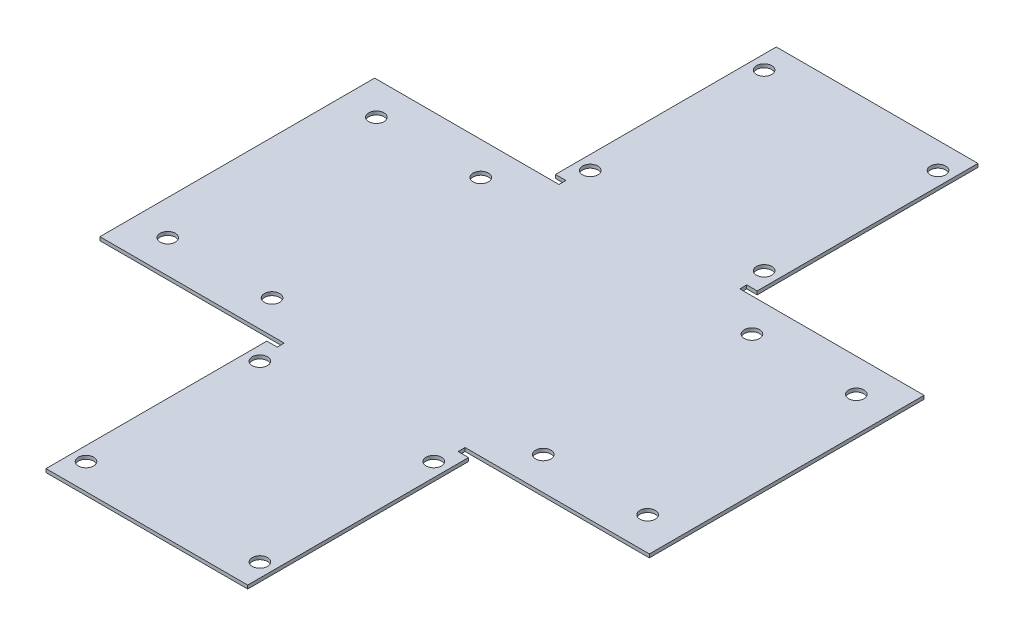
ISO-10303-21;
HEADER;
FILE_DESCRIPTION(('STEP AP214'),'2;1');
FILE_NAME('part.step','',(''),(''),'','','');
FILE_SCHEMA(('AUTOMOTIVE_DESIGN { 1 0 10303 214 1 1 1 1 }'));
ENDSEC;
DATA;
#1=APPLICATION_CONTEXT('core data for automotive mechanical design processes');
#2=APPLICATION_PROTOCOL_DEFINITION('international standard','automotive_design',2000,#1);
#3=PRODUCT_CONTEXT('',#1,'mechanical');
#4=PRODUCT('Part','Part','',(#3));
#5=PRODUCT_RELATED_PRODUCT_CATEGORY('part','',(#4));
#6=PRODUCT_DEFINITION_FORMATION('','',#4);
#7=PRODUCT_DEFINITION_CONTEXT('part definition',#1,'design');
#8=PRODUCT_DEFINITION('design','',#6,#7);
#9=PRODUCT_DEFINITION_SHAPE('','',#8);
#10=(LENGTH_UNIT() NAMED_UNIT(*) SI_UNIT(.MILLI.,.METRE.));
#11=(NAMED_UNIT(*) PLANE_ANGLE_UNIT() SI_UNIT($,.RADIAN.));
#12=(NAMED_UNIT(*) SI_UNIT($,.STERADIAN.) SOLID_ANGLE_UNIT());
#13=UNCERTAINTY_MEASURE_WITH_UNIT(LENGTH_MEASURE(1.E-05),#10,'distance_accuracy_value','');
#14=(GEOMETRIC_REPRESENTATION_CONTEXT(3) GLOBAL_UNCERTAINTY_ASSIGNED_CONTEXT((#13)) GLOBAL_UNIT_ASSIGNED_CONTEXT((#10,
#11,#12)) REPRESENTATION_CONTEXT('',''));
#15=CARTESIAN_POINT('',(0.,0.,0.));
#16=DIRECTION('',(0.,0.,1.));
#17=DIRECTION('',(1.,0.,0.));
#18=AXIS2_PLACEMENT_3D('',#15,#16,#17);
#19=CARTESIAN_POINT('',(0.,1.,0.));
#20=DIRECTION('',(0.,1.,0.));
#21=DIRECTION('',(0.,0.,1.));
#22=AXIS2_PLACEMENT_3D('',#19,#20,#21);
#23=PLANE('',#22);
#24=CARTESIAN_POINT('',(98.,1.,-30.));
#25=DIRECTION('',(0.,1.,0.));
#26=DIRECTION('',(0.,0.,1.));
#27=AXIS2_PLACEMENT_3D('',#24,#25,#26);
#28=CIRCLE('',#27,2.2);
#29=CARTESIAN_POINT('',(98.,1.,-27.8));
#30=VERTEX_POINT('',#29);
#31=EDGE_CURVE('E758',#30,#30,#28,.T.);
#32=ORIENTED_EDGE('',*,*,#31,.F.);
#33=EDGE_LOOP('',(#32));
#34=FACE_BOUND('',#33,.T.);
#35=CARTESIAN_POINT('',(68.,1.,30.));
#36=DIRECTION('',(0.,1.,0.));
#37=DIRECTION('',(0.,0.,1.));
#38=AXIS2_PLACEMENT_3D('',#35,#36,#37);
#39=CIRCLE('',#38,2.2);
#40=CARTESIAN_POINT('',(68.,1.,32.2));
#41=VERTEX_POINT('',#40);
#42=EDGE_CURVE('E770',#41,#41,#39,.T.);
#43=ORIENTED_EDGE('',*,*,#42,.F.);
#44=EDGE_LOOP('',(#43));
#45=FACE_BOUND('',#44,.T.);
#46=CARTESIAN_POINT('',(-40.,1.,30.));
#47=DIRECTION('',(0.,1.,0.));
#48=DIRECTION('',(0.,0.,1.));
#49=AXIS2_PLACEMENT_3D('',#46,#47,#48);
#50=CIRCLE('',#49,2.2);
#51=CARTESIAN_POINT('',(-40.,1.,32.2));
#52=VERTEX_POINT('',#51);
#53=EDGE_CURVE('E782',#52,#52,#50,.T.);
#54=ORIENTED_EDGE('',*,*,#53,.F.);
#55=EDGE_LOOP('',(#54));
#56=FACE_BOUND('',#55,.T.);
#57=CARTESIAN_POINT('',(-40.,1.,-30.));
#58=DIRECTION('',(0.,1.,0.));
#59=DIRECTION('',(0.,0.,1.));
#60=AXIS2_PLACEMENT_3D('',#57,#58,#59);
#61=CIRCLE('',#60,2.2);
#62=CARTESIAN_POINT('',(-40.,1.,-27.8));
#63=VERTEX_POINT('',#62);
#64=EDGE_CURVE('E794',#63,#63,#61,.T.);
#65=ORIENTED_EDGE('',*,*,#64,.F.);
#66=EDGE_LOOP('',(#65));
#67=FACE_BOUND('',#66,.T.);
#68=CARTESIAN_POINT('',(54.,1.,97.5));
#69=DIRECTION('',(0.,1.,0.));
#70=DIRECTION('',(0.,0.,1.));
#71=AXIS2_PLACEMENT_3D('',#68,#69,#70);
#72=CIRCLE('',#71,2.2);
#73=CARTESIAN_POINT('',(54.,1.,99.7));
#74=VERTEX_POINT('',#73);
#75=EDGE_CURVE('E806',#74,#74,#72,.T.);
#76=ORIENTED_EDGE('',*,*,#75,.F.);
#77=EDGE_LOOP('',(#76));
#78=FACE_BOUND('',#77,.T.);
#79=CARTESIAN_POINT('',(4.00000000000001,1.,47.5));
#80=DIRECTION('',(0.,1.,0.));
#81=DIRECTION('',(0.,0.,1.));
#82=AXIS2_PLACEMENT_3D('',#79,#80,#81);
#83=CIRCLE('',#82,2.2);
#84=CARTESIAN_POINT('',(4.00000000000001,1.,49.7));
#85=VERTEX_POINT('',#84);
#86=EDGE_CURVE('E818',#85,#85,#83,.T.);
#87=ORIENTED_EDGE('',*,*,#86,.F.);
#88=EDGE_LOOP('',(#87));
#89=FACE_BOUND('',#88,.T.);
#90=CARTESIAN_POINT('',(54.,1.,-47.5));
#91=DIRECTION('',(0.,1.,0.));
#92=DIRECTION('',(0.,0.,1.));
#93=AXIS2_PLACEMENT_3D('',#90,#91,#92);
#94=CIRCLE('',#93,2.2);
#95=CARTESIAN_POINT('',(54.,1.,-45.3));
#96=VERTEX_POINT('',#95);
#97=EDGE_CURVE('E830',#96,#96,#94,.T.);
#98=ORIENTED_EDGE('',*,*,#97,.F.);
#99=EDGE_LOOP('',(#98));
#100=FACE_BOUND('',#99,.T.);
#101=CARTESIAN_POINT('',(3.99999999999999,1.,-97.5));
#102=DIRECTION('',(0.,1.,0.));
#103=DIRECTION('',(0.,0.,1.));
#104=AXIS2_PLACEMENT_3D('',#101,#102,#103);
#105=CIRCLE('',#104,2.2);
#106=CARTESIAN_POINT('',(3.99999999999999,1.,-95.3000000000001));
#107=VERTEX_POINT('',#106);
#108=EDGE_CURVE('E210',#107,#107,#105,.T.);
#109=ORIENTED_EDGE('',*,*,#108,.F.);
#110=EDGE_LOOP('',(#109));
#111=FACE_BOUND('',#110,.T.);
#112=DIRECTION('',(-1.,0.,0.));
#113=VECTOR('',#112,1.);
#114=CARTESIAN_POINT('',(0.,1.,-39.5));
#115=LINE('',#114,#113);
#116=CARTESIAN_POINT('',(3.00000000000001,1.,-39.5));
#117=VERTEX_POINT('',#116);
#118=CARTESIAN_POINT('',(-50.,1.,-39.5));
#119=VERTEX_POINT('',#118);
#120=EDGE_CURVE('E50',#117,#119,#115,.T.);
#121=ORIENTED_EDGE('',*,*,#120,.T.);
#122=DIRECTION('',(0.,0.,1.));
#123=VECTOR('',#122,1.);
#124=CARTESIAN_POINT('',(-50.,1.,-39.5));
#125=LINE('',#124,#123);
#126=CARTESIAN_POINT('',(-50.,1.,39.5));
#127=VERTEX_POINT('',#126);
#128=EDGE_CURVE('E130',#119,#127,#125,.T.);
#129=ORIENTED_EDGE('',*,*,#128,.T.);
#130=DIRECTION('',(1.,0.,0.));
#131=VECTOR('',#130,1.);
#132=CARTESIAN_POINT('',(-50.,1.,39.5));
#133=LINE('',#132,#131);
#134=CARTESIAN_POINT('',(3.00000000000002,1.,39.5));
#135=VERTEX_POINT('',#134);
#136=EDGE_CURVE('E296',#127,#135,#133,.T.);
#137=ORIENTED_EDGE('',*,*,#136,.T.);
#138=DIRECTION('',(0.,0.,1.));
#139=VECTOR('',#138,1.);
#140=CARTESIAN_POINT('',(3.00000000000002,1.,39.5));
#141=LINE('',#140,#139);
#142=CARTESIAN_POINT('',(3.00000000000002,1.,41.5));
#143=VERTEX_POINT('',#142);
#144=EDGE_CURVE('E316',#135,#143,#141,.T.);
#145=ORIENTED_EDGE('',*,*,#144,.T.);
#146=DIRECTION('',(-1.,0.,0.));
#147=VECTOR('',#146,1.);
#148=CARTESIAN_POINT('',(3.00000000000002,1.,41.5));
#149=LINE('',#148,#147);
#150=CARTESIAN_POINT('',(0.,1.,41.5));
#151=VERTEX_POINT('',#150);
#152=EDGE_CURVE('E313',#143,#151,#149,.T.);
#153=ORIENTED_EDGE('',*,*,#152,.T.);
#154=DIRECTION('',(0.,0.,1.));
#155=VECTOR('',#154,1.);
#156=CARTESIAN_POINT('',(0.,1.,41.5));
#157=LINE('',#156,#155);
#158=CARTESIAN_POINT('',(0.,1.,105.));
#159=VERTEX_POINT('',#158);
#160=EDGE_CURVE('E315',#151,#159,#157,.T.);
#161=ORIENTED_EDGE('',*,*,#160,.T.);
#162=DIRECTION('',(1.,0.,0.));
#163=VECTOR('',#162,1.);
#164=CARTESIAN_POINT('',(0.,1.,105.));
#165=LINE('',#164,#163);
#166=CARTESIAN_POINT('',(58.,1.,105.));
#167=VERTEX_POINT('',#166);
#168=EDGE_CURVE('E318',#159,#167,#165,.T.);
#169=ORIENTED_EDGE('',*,*,#168,.T.);
#170=DIRECTION('',(0.,0.,-1.));
#171=VECTOR('',#170,1.);
#172=CARTESIAN_POINT('',(58.,1.,105.));
#173=LINE('',#172,#171);
#174=CARTESIAN_POINT('',(58.,1.,41.5));
#175=VERTEX_POINT('',#174);
#176=EDGE_CURVE('E324',#167,#175,#173,.T.);
#177=ORIENTED_EDGE('',*,*,#176,.T.);
#178=DIRECTION('',(-1.,0.,0.));
#179=VECTOR('',#178,1.);
#180=CARTESIAN_POINT('',(58.,1.,41.5));
#181=LINE('',#180,#179);
#182=CARTESIAN_POINT('',(55.,1.,41.5));
#183=VERTEX_POINT('',#182);
#184=EDGE_CURVE('E326',#175,#183,#181,.T.);
#185=ORIENTED_EDGE('',*,*,#184,.T.);
#186=DIRECTION('',(0.,0.,-1.));
#187=VECTOR('',#186,1.);
#188=CARTESIAN_POINT('',(55.,1.,41.5));
#189=LINE('',#188,#187);
#190=CARTESIAN_POINT('',(55.,1.,39.5));
#191=VERTEX_POINT('',#190);
#192=EDGE_CURVE('E328',#183,#191,#189,.T.);
#193=ORIENTED_EDGE('',*,*,#192,.T.);
#194=DIRECTION('',(1.,0.,0.));
#195=VECTOR('',#194,1.);
#196=CARTESIAN_POINT('',(55.,1.,39.5));
#197=LINE('',#196,#195);
#198=CARTESIAN_POINT('',(108.,1.,39.5));
#199=VERTEX_POINT('',#198);
#200=EDGE_CURVE('E330',#191,#199,#197,.T.);
#201=ORIENTED_EDGE('',*,*,#200,.T.);
#202=DIRECTION('',(0.,0.,-1.));
#203=VECTOR('',#202,1.);
#204=CARTESIAN_POINT('',(108.,1.,39.5));
#205=LINE('',#204,#203);
#206=CARTESIAN_POINT('',(108.,1.,-39.5));
#207=VERTEX_POINT('',#206);
#208=EDGE_CURVE('E332',#199,#207,#205,.T.);
#209=ORIENTED_EDGE('',*,*,#208,.T.);
#210=DIRECTION('',(-1.,0.,0.));
#211=VECTOR('',#210,1.);
#212=CARTESIAN_POINT('',(108.,1.,-39.5));
#213=LINE('',#212,#211);
#214=CARTESIAN_POINT('',(55.,1.,-39.5));
#215=VERTEX_POINT('',#214);
#216=EDGE_CURVE('E334',#207,#215,#213,.T.);
#217=ORIENTED_EDGE('',*,*,#216,.T.);
#218=DIRECTION('',(0.,0.,-1.));
#219=VECTOR('',#218,1.);
#220=CARTESIAN_POINT('',(55.,1.,-39.5));
#221=LINE('',#220,#219);
#222=CARTESIAN_POINT('',(55.,1.,-41.5));
#223=VERTEX_POINT('',#222);
#224=EDGE_CURVE('E336',#215,#223,#221,.T.);
#225=ORIENTED_EDGE('',*,*,#224,.T.);
#226=DIRECTION('',(1.,0.,0.));
#227=VECTOR('',#226,1.);
#228=CARTESIAN_POINT('',(55.,1.,-41.5));
#229=LINE('',#228,#227);
#230=CARTESIAN_POINT('',(58.,1.,-41.5));
#231=VERTEX_POINT('',#230);
#232=EDGE_CURVE('E338',#223,#231,#229,.T.);
#233=ORIENTED_EDGE('',*,*,#232,.T.);
#234=DIRECTION('',(0.,0.,-1.));
#235=VECTOR('',#234,1.);
#236=CARTESIAN_POINT('',(58.,1.,-41.5));
#237=LINE('',#236,#235);
#238=CARTESIAN_POINT('',(58.,1.,-105.));
#239=VERTEX_POINT('',#238);
#240=EDGE_CURVE('E340',#231,#239,#237,.T.);
#241=ORIENTED_EDGE('',*,*,#240,.T.);
#242=DIRECTION('',(-1.,0.,0.));
#243=VECTOR('',#242,1.);
#244=CARTESIAN_POINT('',(58.,1.,-105.));
#245=LINE('',#244,#243);
#246=CARTESIAN_POINT('',(0.,1.,-105.));
#247=VERTEX_POINT('',#246);
#248=EDGE_CURVE('E186',#239,#247,#245,.T.);
#249=ORIENTED_EDGE('',*,*,#248,.T.);
#250=DIRECTION('',(0.,0.,1.));
#251=VECTOR('',#250,1.);
#252=CARTESIAN_POINT('',(0.,1.,-105.));
#253=LINE('',#252,#251);
#254=CARTESIAN_POINT('',(0.,1.,-41.5));
#255=VERTEX_POINT('',#254);
#256=EDGE_CURVE('E180',#247,#255,#253,.T.);
#257=ORIENTED_EDGE('',*,*,#256,.T.);
#258=DIRECTION('',(1.,0.,0.));
#259=VECTOR('',#258,1.);
#260=CARTESIAN_POINT('',(0.,1.,-41.5));
#261=LINE('',#260,#259);
#262=CARTESIAN_POINT('',(3.00000000000001,1.,-41.5));
#263=VERTEX_POINT('',#262);
#264=EDGE_CURVE('E184',#255,#263,#261,.T.);
#265=ORIENTED_EDGE('',*,*,#264,.T.);
#266=DIRECTION('',(0.,0.,1.));
#267=VECTOR('',#266,1.);
#268=CARTESIAN_POINT('',(3.00000000000001,1.,-41.5));
#269=LINE('',#268,#267);
#270=EDGE_CURVE('E200',#263,#117,#269,.T.);
#271=ORIENTED_EDGE('',*,*,#270,.T.);
#272=EDGE_LOOP('',(#121,#129,#137,#145,#153,#161,#169,#177,#185,#193,#201,#209,#217,#225,#233,
#241,#249,#257,#265,#271));
#273=FACE_BOUND('',#272,.T.);
#274=CARTESIAN_POINT('',(54.,1.,-97.5));
#275=DIRECTION('',(0.,1.,0.));
#276=DIRECTION('',(0.,0.,1.));
#277=AXIS2_PLACEMENT_3D('',#274,#275,#276);
#278=CIRCLE('',#277,2.2);
#279=CARTESIAN_POINT('',(54.,1.,-95.3000000000001));
#280=VERTEX_POINT('',#279);
#281=EDGE_CURVE('E836',#280,#280,#278,.T.);
#282=ORIENTED_EDGE('',*,*,#281,.F.);
#283=EDGE_LOOP('',(#282));
#284=FACE_BOUND('',#283,.T.);
#285=CARTESIAN_POINT('',(4.,1.,-47.5));
#286=DIRECTION('',(0.,1.,0.));
#287=DIRECTION('',(0.,0.,1.));
#288=AXIS2_PLACEMENT_3D('',#285,#286,#287);
#289=CIRCLE('',#288,2.2);
#290=CARTESIAN_POINT('',(4.,1.,-45.3));
#291=VERTEX_POINT('',#290);
#292=EDGE_CURVE('E824',#291,#291,#289,.T.);
#293=ORIENTED_EDGE('',*,*,#292,.F.);
#294=EDGE_LOOP('',(#293));
#295=FACE_BOUND('',#294,.T.);
#296=CARTESIAN_POINT('',(54.,1.,47.5));
#297=DIRECTION('',(0.,1.,0.));
#298=DIRECTION('',(0.,0.,1.));
#299=AXIS2_PLACEMENT_3D('',#296,#297,#298);
#300=CIRCLE('',#299,2.2);
#301=CARTESIAN_POINT('',(54.,1.,49.7));
#302=VERTEX_POINT('',#301);
#303=EDGE_CURVE('E812',#302,#302,#300,.T.);
#304=ORIENTED_EDGE('',*,*,#303,.F.);
#305=EDGE_LOOP('',(#304));
#306=FACE_BOUND('',#305,.T.);
#307=CARTESIAN_POINT('',(4.00000000000001,1.,97.5));
#308=DIRECTION('',(0.,1.,0.));
#309=DIRECTION('',(0.,0.,1.));
#310=AXIS2_PLACEMENT_3D('',#307,#308,#309);
#311=CIRCLE('',#310,2.2);
#312=CARTESIAN_POINT('',(4.00000000000001,1.,99.7));
#313=VERTEX_POINT('',#312);
#314=EDGE_CURVE('E800',#313,#313,#311,.T.);
#315=ORIENTED_EDGE('',*,*,#314,.F.);
#316=EDGE_LOOP('',(#315));
#317=FACE_BOUND('',#316,.T.);
#318=CARTESIAN_POINT('',(-9.99999999999999,1.,-30.));
#319=DIRECTION('',(0.,1.,0.));
#320=DIRECTION('',(0.,0.,1.));
#321=AXIS2_PLACEMENT_3D('',#318,#319,#320);
#322=CIRCLE('',#321,2.2);
#323=CARTESIAN_POINT('',(-9.99999999999999,1.,-27.8));
#324=VERTEX_POINT('',#323);
#325=EDGE_CURVE('E788',#324,#324,#322,.T.);
#326=ORIENTED_EDGE('',*,*,#325,.F.);
#327=EDGE_LOOP('',(#326));
#328=FACE_BOUND('',#327,.T.);
#329=CARTESIAN_POINT('',(-9.99999999999999,1.,30.));
#330=DIRECTION('',(0.,1.,0.));
#331=DIRECTION('',(0.,0.,1.));
#332=AXIS2_PLACEMENT_3D('',#329,#330,#331);
#333=CIRCLE('',#332,2.2);
#334=CARTESIAN_POINT('',(-9.99999999999999,1.,32.2));
#335=VERTEX_POINT('',#334);
#336=EDGE_CURVE('E776',#335,#335,#333,.T.);
#337=ORIENTED_EDGE('',*,*,#336,.F.);
#338=EDGE_LOOP('',(#337));
#339=FACE_BOUND('',#338,.T.);
#340=CARTESIAN_POINT('',(98.,1.,30.));
#341=DIRECTION('',(0.,1.,0.));
#342=DIRECTION('',(0.,0.,1.));
#343=AXIS2_PLACEMENT_3D('',#340,#341,#342);
#344=CIRCLE('',#343,2.2);
#345=CARTESIAN_POINT('',(98.,1.,32.2));
#346=VERTEX_POINT('',#345);
#347=EDGE_CURVE('E764',#346,#346,#344,.T.);
#348=ORIENTED_EDGE('',*,*,#347,.F.);
#349=EDGE_LOOP('',(#348));
#350=FACE_BOUND('',#349,.T.);
#351=CARTESIAN_POINT('',(68.,1.,-30.));
#352=DIRECTION('',(0.,1.,0.));
#353=DIRECTION('',(0.,0.,1.));
#354=AXIS2_PLACEMENT_3D('',#351,#352,#353);
#355=CIRCLE('',#354,2.2);
#356=CARTESIAN_POINT('',(68.,1.,-27.8));
#357=VERTEX_POINT('',#356);
#358=EDGE_CURVE('E749',#357,#357,#355,.T.);
#359=ORIENTED_EDGE('',*,*,#358,.F.);
#360=EDGE_LOOP('',(#359));
#361=FACE_BOUND('',#360,.T.);
#362=ADVANCED_FACE('F33',(#34,#45,#56,#67,#78,#89,#100,#111,#273,#284,#295,#306,#317,#328,#339,
#350,#361),#23,.T.);
#363=CARTESIAN_POINT('',(0.,0.,0.));
#364=DIRECTION('',(0.,1.,0.));
#365=DIRECTION('',(0.,0.,1.));
#366=AXIS2_PLACEMENT_3D('',#363,#364,#365);
#367=PLANE('',#366);
#368=DIRECTION('',(0.,0.,1.));
#369=VECTOR('',#368,1.);
#370=CARTESIAN_POINT('',(-50.,0.,-39.5));
#371=LINE('',#370,#369);
#372=CARTESIAN_POINT('',(-50.,0.,-39.5));
#373=VERTEX_POINT('',#372);
#374=CARTESIAN_POINT('',(-50.,0.,39.5));
#375=VERTEX_POINT('',#374);
#376=EDGE_CURVE('E206',#373,#375,#371,.T.);
#377=ORIENTED_EDGE('',*,*,#376,.F.);
#378=DIRECTION('',(-1.,0.,0.));
#379=VECTOR('',#378,1.);
#380=CARTESIAN_POINT('',(3.00000000000001,0.,-39.5));
#381=LINE('',#380,#379);
#382=CARTESIAN_POINT('',(3.00000000000001,0.,-39.5));
#383=VERTEX_POINT('',#382);
#384=EDGE_CURVE('E245',#383,#373,#381,.T.);
#385=ORIENTED_EDGE('',*,*,#384,.F.);
#386=DIRECTION('',(0.,0.,1.));
#387=VECTOR('',#386,1.);
#388=CARTESIAN_POINT('',(3.00000000000001,0.,-41.5));
#389=LINE('',#388,#387);
#390=CARTESIAN_POINT('',(3.00000000000001,0.,-41.5));
#391=VERTEX_POINT('',#390);
#392=EDGE_CURVE('E123',#391,#383,#389,.T.);
#393=ORIENTED_EDGE('',*,*,#392,.F.);
#394=DIRECTION('',(1.,0.,0.));
#395=VECTOR('',#394,1.);
#396=CARTESIAN_POINT('',(0.,0.,-41.5));
#397=LINE('',#396,#395);
#398=CARTESIAN_POINT('',(0.,0.,-41.5));
#399=VERTEX_POINT('',#398);
#400=EDGE_CURVE('E116',#399,#391,#397,.T.);
#401=ORIENTED_EDGE('',*,*,#400,.F.);
#402=DIRECTION('',(0.,0.,1.));
#403=VECTOR('',#402,1.);
#404=CARTESIAN_POINT('',(0.,0.,-105.));
#405=LINE('',#404,#403);
#406=CARTESIAN_POINT('',(0.,0.,-105.));
#407=VERTEX_POINT('',#406);
#408=EDGE_CURVE('E194',#407,#399,#405,.T.);
#409=ORIENTED_EDGE('',*,*,#408,.F.);
#410=DIRECTION('',(-1.,0.,0.));
#411=VECTOR('',#410,1.);
#412=CARTESIAN_POINT('',(58.,0.,-105.));
#413=LINE('',#412,#411);
#414=CARTESIAN_POINT('',(58.,0.,-105.));
#415=VERTEX_POINT('',#414);
#416=EDGE_CURVE('E240',#415,#407,#413,.T.);
#417=ORIENTED_EDGE('',*,*,#416,.F.);
#418=DIRECTION('',(0.,0.,-1.));
#419=VECTOR('',#418,1.);
#420=CARTESIAN_POINT('',(58.,0.,-41.5));
#421=LINE('',#420,#419);
#422=CARTESIAN_POINT('',(58.,0.,-41.5));
#423=VERTEX_POINT('',#422);
#424=EDGE_CURVE('E238',#423,#415,#421,.T.);
#425=ORIENTED_EDGE('',*,*,#424,.F.);
#426=DIRECTION('',(1.,0.,0.));
#427=VECTOR('',#426,1.);
#428=CARTESIAN_POINT('',(55.,0.,-41.5));
#429=LINE('',#428,#427);
#430=CARTESIAN_POINT('',(55.,0.,-41.5));
#431=VERTEX_POINT('',#430);
#432=EDGE_CURVE('E236',#431,#423,#429,.T.);
#433=ORIENTED_EDGE('',*,*,#432,.F.);
#434=DIRECTION('',(0.,0.,-1.));
#435=VECTOR('',#434,1.);
#436=CARTESIAN_POINT('',(55.,0.,-39.5));
#437=LINE('',#436,#435);
#438=CARTESIAN_POINT('',(55.,0.,-39.5));
#439=VERTEX_POINT('',#438);
#440=EDGE_CURVE('E234',#439,#431,#437,.T.);
#441=ORIENTED_EDGE('',*,*,#440,.F.);
#442=DIRECTION('',(-1.,0.,0.));
#443=VECTOR('',#442,1.);
#444=CARTESIAN_POINT('',(58.,0.,-39.5));
#445=LINE('',#444,#443);
#446=CARTESIAN_POINT('',(108.,0.,-39.5));
#447=VERTEX_POINT('',#446);
#448=EDGE_CURVE('E232',#447,#439,#445,.T.);
#449=ORIENTED_EDGE('',*,*,#448,.F.);
#450=DIRECTION('',(0.,0.,-1.));
#451=VECTOR('',#450,1.);
#452=CARTESIAN_POINT('',(108.,0.,39.5));
#453=LINE('',#452,#451);
#454=CARTESIAN_POINT('',(108.,0.,39.5));
#455=VERTEX_POINT('',#454);
#456=EDGE_CURVE('E229',#455,#447,#453,.T.);
#457=ORIENTED_EDGE('',*,*,#456,.F.);
#458=DIRECTION('',(1.,0.,0.));
#459=VECTOR('',#458,1.);
#460=CARTESIAN_POINT('',(58.,0.,39.5));
#461=LINE('',#460,#459);
#462=CARTESIAN_POINT('',(55.,0.,39.5));
#463=VERTEX_POINT('',#462);
#464=EDGE_CURVE('E227',#463,#455,#461,.T.);
#465=ORIENTED_EDGE('',*,*,#464,.F.);
#466=DIRECTION('',(0.,0.,-1.));
#467=VECTOR('',#466,1.);
#468=CARTESIAN_POINT('',(55.,0.,41.5));
#469=LINE('',#468,#467);
#470=CARTESIAN_POINT('',(55.,0.,41.5));
#471=VERTEX_POINT('',#470);
#472=EDGE_CURVE('E224',#471,#463,#469,.T.);
#473=ORIENTED_EDGE('',*,*,#472,.F.);
#474=DIRECTION('',(-1.,0.,0.));
#475=VECTOR('',#474,1.);
#476=CARTESIAN_POINT('',(58.,0.,41.5));
#477=LINE('',#476,#475);
#478=CARTESIAN_POINT('',(58.,0.,41.5));
#479=VERTEX_POINT('',#478);
#480=EDGE_CURVE('E222',#479,#471,#477,.T.);
#481=ORIENTED_EDGE('',*,*,#480,.F.);
#482=DIRECTION('',(0.,0.,-1.));
#483=VECTOR('',#482,1.);
#484=CARTESIAN_POINT('',(58.,0.,105.));
#485=LINE('',#484,#483);
#486=CARTESIAN_POINT('',(58.,0.,105.));
#487=VERTEX_POINT('',#486);
#488=EDGE_CURVE('E220',#487,#479,#485,.T.);
#489=ORIENTED_EDGE('',*,*,#488,.F.);
#490=DIRECTION('',(1.,0.,0.));
#491=VECTOR('',#490,1.);
#492=CARTESIAN_POINT('',(0.,0.,105.));
#493=LINE('',#492,#491);
#494=CARTESIAN_POINT('',(0.,0.,105.));
#495=VERTEX_POINT('',#494);
#496=EDGE_CURVE('E218',#495,#487,#493,.T.);
#497=ORIENTED_EDGE('',*,*,#496,.F.);
#498=DIRECTION('',(0.,0.,1.));
#499=VECTOR('',#498,1.);
#500=CARTESIAN_POINT('',(0.,0.,41.5));
#501=LINE('',#500,#499);
#502=CARTESIAN_POINT('',(0.,0.,41.5));
#503=VERTEX_POINT('',#502);
#504=EDGE_CURVE('E216',#503,#495,#501,.T.);
#505=ORIENTED_EDGE('',*,*,#504,.F.);
#506=DIRECTION('',(-1.,0.,0.));
#507=VECTOR('',#506,1.);
#508=CARTESIAN_POINT('',(3.00000000000002,0.,41.5));
#509=LINE('',#508,#507);
#510=CARTESIAN_POINT('',(3.00000000000002,0.,41.5));
#511=VERTEX_POINT('',#510);
#512=EDGE_CURVE('E214',#511,#503,#509,.T.);
#513=ORIENTED_EDGE('',*,*,#512,.F.);
#514=DIRECTION('',(0.,0.,1.));
#515=VECTOR('',#514,1.);
#516=CARTESIAN_POINT('',(3.00000000000002,0.,39.5));
#517=LINE('',#516,#515);
#518=CARTESIAN_POINT('',(3.00000000000002,0.,39.5));
#519=VERTEX_POINT('',#518);
#520=EDGE_CURVE('E212',#519,#511,#517,.T.);
#521=ORIENTED_EDGE('',*,*,#520,.F.);
#522=DIRECTION('',(1.,0.,0.));
#523=VECTOR('',#522,1.);
#524=CARTESIAN_POINT('',(0.,0.,39.5));
#525=LINE('',#524,#523);
#526=EDGE_CURVE('E209',#375,#519,#525,.T.);
#527=ORIENTED_EDGE('',*,*,#526,.F.);
#528=EDGE_LOOP('',(#377,#385,#393,#401,#409,#417,#425,#433,#441,#449,#457,#465,#473,#481,#489,
#497,#505,#513,#521,#527));
#529=FACE_BOUND('',#528,.T.);
#530=CARTESIAN_POINT('',(3.99999999999999,0.,-97.5));
#531=DIRECTION('',(0.,1.,0.));
#532=DIRECTION('',(0.,0.,1.));
#533=AXIS2_PLACEMENT_3D('',#530,#531,#532);
#534=CIRCLE('',#533,2.2);
#535=CARTESIAN_POINT('',(3.99999999999999,0.,-95.3000000000001));
#536=VERTEX_POINT('',#535);
#537=EDGE_CURVE('E839',#536,#536,#534,.T.);
#538=ORIENTED_EDGE('',*,*,#537,.T.);
#539=EDGE_LOOP('',(#538));
#540=FACE_BOUND('',#539,.T.);
#541=CARTESIAN_POINT('',(54.,0.,-97.5));
#542=DIRECTION('',(0.,1.,0.));
#543=DIRECTION('',(0.,0.,1.));
#544=AXIS2_PLACEMENT_3D('',#541,#542,#543);
#545=CIRCLE('',#544,2.2);
#546=CARTESIAN_POINT('',(54.,0.,-95.3000000000001));
#547=VERTEX_POINT('',#546);
#548=EDGE_CURVE('E833',#547,#547,#545,.T.);
#549=ORIENTED_EDGE('',*,*,#548,.T.);
#550=EDGE_LOOP('',(#549));
#551=FACE_BOUND('',#550,.T.);
#552=CARTESIAN_POINT('',(54.,0.,-47.5));
#553=DIRECTION('',(0.,1.,0.));
#554=DIRECTION('',(0.,0.,1.));
#555=AXIS2_PLACEMENT_3D('',#552,#553,#554);
#556=CIRCLE('',#555,2.2);
#557=CARTESIAN_POINT('',(54.,0.,-45.3));
#558=VERTEX_POINT('',#557);
#559=EDGE_CURVE('E827',#558,#558,#556,.T.);
#560=ORIENTED_EDGE('',*,*,#559,.T.);
#561=EDGE_LOOP('',(#560));
#562=FACE_BOUND('',#561,.T.);
#563=CARTESIAN_POINT('',(4.,0.,-47.5));
#564=DIRECTION('',(0.,1.,0.));
#565=DIRECTION('',(0.,0.,1.));
#566=AXIS2_PLACEMENT_3D('',#563,#564,#565);
#567=CIRCLE('',#566,2.2);
#568=CARTESIAN_POINT('',(4.,0.,-45.3));
#569=VERTEX_POINT('',#568);
#570=EDGE_CURVE('E821',#569,#569,#567,.T.);
#571=ORIENTED_EDGE('',*,*,#570,.T.);
#572=EDGE_LOOP('',(#571));
#573=FACE_BOUND('',#572,.T.);
#574=CARTESIAN_POINT('',(4.00000000000001,0.,47.5));
#575=DIRECTION('',(0.,1.,0.));
#576=DIRECTION('',(0.,0.,1.));
#577=AXIS2_PLACEMENT_3D('',#574,#575,#576);
#578=CIRCLE('',#577,2.2);
#579=CARTESIAN_POINT('',(4.00000000000001,0.,49.7));
#580=VERTEX_POINT('',#579);
#581=EDGE_CURVE('E815',#580,#580,#578,.T.);
#582=ORIENTED_EDGE('',*,*,#581,.T.);
#583=EDGE_LOOP('',(#582));
#584=FACE_BOUND('',#583,.T.);
#585=CARTESIAN_POINT('',(54.,0.,47.5));
#586=DIRECTION('',(0.,1.,0.));
#587=DIRECTION('',(0.,0.,1.));
#588=AXIS2_PLACEMENT_3D('',#585,#586,#587);
#589=CIRCLE('',#588,2.2);
#590=CARTESIAN_POINT('',(54.,0.,49.7));
#591=VERTEX_POINT('',#590);
#592=EDGE_CURVE('E809',#591,#591,#589,.T.);
#593=ORIENTED_EDGE('',*,*,#592,.T.);
#594=EDGE_LOOP('',(#593));
#595=FACE_BOUND('',#594,.T.);
#596=CARTESIAN_POINT('',(54.,0.,97.5));
#597=DIRECTION('',(0.,1.,0.));
#598=DIRECTION('',(0.,0.,1.));
#599=AXIS2_PLACEMENT_3D('',#596,#597,#598);
#600=CIRCLE('',#599,2.2);
#601=CARTESIAN_POINT('',(54.,0.,99.7));
#602=VERTEX_POINT('',#601);
#603=EDGE_CURVE('E803',#602,#602,#600,.T.);
#604=ORIENTED_EDGE('',*,*,#603,.T.);
#605=EDGE_LOOP('',(#604));
#606=FACE_BOUND('',#605,.T.);
#607=CARTESIAN_POINT('',(4.00000000000001,0.,97.5));
#608=DIRECTION('',(0.,1.,0.));
#609=DIRECTION('',(0.,0.,1.));
#610=AXIS2_PLACEMENT_3D('',#607,#608,#609);
#611=CIRCLE('',#610,2.2);
#612=CARTESIAN_POINT('',(4.00000000000001,0.,99.7));
#613=VERTEX_POINT('',#612);
#614=EDGE_CURVE('E797',#613,#613,#611,.T.);
#615=ORIENTED_EDGE('',*,*,#614,.T.);
#616=EDGE_LOOP('',(#615));
#617=FACE_BOUND('',#616,.T.);
#618=CARTESIAN_POINT('',(-40.,0.,-30.));
#619=DIRECTION('',(0.,1.,0.));
#620=DIRECTION('',(0.,0.,1.));
#621=AXIS2_PLACEMENT_3D('',#618,#619,#620);
#622=CIRCLE('',#621,2.2);
#623=CARTESIAN_POINT('',(-40.,0.,-27.8));
#624=VERTEX_POINT('',#623);
#625=EDGE_CURVE('E791',#624,#624,#622,.T.);
#626=ORIENTED_EDGE('',*,*,#625,.T.);
#627=EDGE_LOOP('',(#626));
#628=FACE_BOUND('',#627,.T.);
#629=CARTESIAN_POINT('',(-9.99999999999999,0.,-30.));
#630=DIRECTION('',(0.,1.,0.));
#631=DIRECTION('',(0.,0.,1.));
#632=AXIS2_PLACEMENT_3D('',#629,#630,#631);
#633=CIRCLE('',#632,2.2);
#634=CARTESIAN_POINT('',(-9.99999999999999,0.,-27.8));
#635=VERTEX_POINT('',#634);
#636=EDGE_CURVE('E785',#635,#635,#633,.T.);
#637=ORIENTED_EDGE('',*,*,#636,.T.);
#638=EDGE_LOOP('',(#637));
#639=FACE_BOUND('',#638,.T.);
#640=CARTESIAN_POINT('',(-40.,0.,30.));
#641=DIRECTION('',(0.,1.,0.));
#642=DIRECTION('',(0.,0.,1.));
#643=AXIS2_PLACEMENT_3D('',#640,#641,#642);
#644=CIRCLE('',#643,2.2);
#645=CARTESIAN_POINT('',(-40.,0.,32.2));
#646=VERTEX_POINT('',#645);
#647=EDGE_CURVE('E779',#646,#646,#644,.T.);
#648=ORIENTED_EDGE('',*,*,#647,.T.);
#649=EDGE_LOOP('',(#648));
#650=FACE_BOUND('',#649,.T.);
#651=CARTESIAN_POINT('',(-9.99999999999999,0.,30.));
#652=DIRECTION('',(0.,1.,0.));
#653=DIRECTION('',(0.,0.,1.));
#654=AXIS2_PLACEMENT_3D('',#651,#652,#653);
#655=CIRCLE('',#654,2.2);
#656=CARTESIAN_POINT('',(-9.99999999999999,0.,32.2));
#657=VERTEX_POINT('',#656);
#658=EDGE_CURVE('E773',#657,#657,#655,.T.);
#659=ORIENTED_EDGE('',*,*,#658,.T.);
#660=EDGE_LOOP('',(#659));
#661=FACE_BOUND('',#660,.T.);
#662=CARTESIAN_POINT('',(68.,0.,30.));
#663=DIRECTION('',(0.,1.,0.));
#664=DIRECTION('',(0.,0.,1.));
#665=AXIS2_PLACEMENT_3D('',#662,#663,#664);
#666=CIRCLE('',#665,2.2);
#667=CARTESIAN_POINT('',(68.,0.,32.2));
#668=VERTEX_POINT('',#667);
#669=EDGE_CURVE('E767',#668,#668,#666,.T.);
#670=ORIENTED_EDGE('',*,*,#669,.T.);
#671=EDGE_LOOP('',(#670));
#672=FACE_BOUND('',#671,.T.);
#673=CARTESIAN_POINT('',(98.,0.,30.));
#674=DIRECTION('',(0.,1.,0.));
#675=DIRECTION('',(0.,0.,1.));
#676=AXIS2_PLACEMENT_3D('',#673,#674,#675);
#677=CIRCLE('',#676,2.2);
#678=CARTESIAN_POINT('',(98.,0.,32.2));
#679=VERTEX_POINT('',#678);
#680=EDGE_CURVE('E761',#679,#679,#677,.T.);
#681=ORIENTED_EDGE('',*,*,#680,.T.);
#682=EDGE_LOOP('',(#681));
#683=FACE_BOUND('',#682,.T.);
#684=CARTESIAN_POINT('',(98.,0.,-30.));
#685=DIRECTION('',(0.,1.,0.));
#686=DIRECTION('',(0.,0.,1.));
#687=AXIS2_PLACEMENT_3D('',#684,#685,#686);
#688=CIRCLE('',#687,2.2);
#689=CARTESIAN_POINT('',(98.,0.,-27.8));
#690=VERTEX_POINT('',#689);
#691=EDGE_CURVE('E755',#690,#690,#688,.T.);
#692=ORIENTED_EDGE('',*,*,#691,.T.);
#693=EDGE_LOOP('',(#692));
#694=FACE_BOUND('',#693,.T.);
#695=CARTESIAN_POINT('',(68.,0.,-30.));
#696=DIRECTION('',(0.,1.,0.));
#697=DIRECTION('',(0.,0.,1.));
#698=AXIS2_PLACEMENT_3D('',#695,#696,#697);
#699=CIRCLE('',#698,2.2);
#700=CARTESIAN_POINT('',(68.,0.,-27.8));
#701=VERTEX_POINT('',#700);
#702=EDGE_CURVE('E752',#701,#701,#699,.T.);
#703=ORIENTED_EDGE('',*,*,#702,.T.);
#704=EDGE_LOOP('',(#703));
#705=FACE_BOUND('',#704,.T.);
#706=ADVANCED_FACE('F300',(#529,#540,#551,#562,#573,#584,#595,#606,#617,#628,#639,#650,#661,
#672,#683,#694,#705),#367,.F.);
#707=CARTESIAN_POINT('',(-50.,1.,-39.5));
#708=DIRECTION('',(1.,0.,0.));
#709=DIRECTION('',(0.,0.,-1.));
#710=AXIS2_PLACEMENT_3D('',#707,#708,#709);
#711=PLANE('',#710);
#712=ORIENTED_EDGE('',*,*,#376,.T.);
#713=DIRECTION('',(0.,-1.,0.));
#714=VECTOR('',#713,1.);
#715=CARTESIAN_POINT('',(-50.,1.,39.5));
#716=LINE('',#715,#714);
#717=EDGE_CURVE('E42',#127,#375,#716,.T.);
#718=ORIENTED_EDGE('',*,*,#717,.F.);
#719=ORIENTED_EDGE('',*,*,#128,.F.);
#720=DIRECTION('',(0.,-1.,0.));
#721=VECTOR('',#720,1.);
#722=CARTESIAN_POINT('',(-50.,1.,-39.5));
#723=LINE('',#722,#721);
#724=EDGE_CURVE('E11',#119,#373,#723,.T.);
#725=ORIENTED_EDGE('',*,*,#724,.T.);
#726=EDGE_LOOP('',(#712,#718,#719,#725));
#727=FACE_BOUND('',#726,.T.);
#728=ADVANCED_FACE('F35',(#727),#711,.F.);
#729=CARTESIAN_POINT('',(0.,1.,39.5));
#730=DIRECTION('',(0.,0.,-1.));
#731=DIRECTION('',(-1.,0.,0.));
#732=AXIS2_PLACEMENT_3D('',#729,#730,#731);
#733=PLANE('',#732);
#734=ORIENTED_EDGE('',*,*,#526,.T.);
#735=DIRECTION('',(0.,-1.,0.));
#736=VECTOR('',#735,1.);
#737=CARTESIAN_POINT('',(3.00000000000002,1.,39.5));
#738=LINE('',#737,#736);
#739=EDGE_CURVE('E289',#135,#519,#738,.T.);
#740=ORIENTED_EDGE('',*,*,#739,.F.);
#741=ORIENTED_EDGE('',*,*,#136,.F.);
#742=ORIENTED_EDGE('',*,*,#717,.T.);
#743=EDGE_LOOP('',(#734,#740,#741,#742));
#744=FACE_BOUND('',#743,.T.);
#745=ADVANCED_FACE('F294',(#744),#733,.F.);
#746=CARTESIAN_POINT('',(3.00000000000002,1.,39.5));
#747=DIRECTION('',(1.,0.,0.));
#748=DIRECTION('',(0.,0.,-1.));
#749=AXIS2_PLACEMENT_3D('',#746,#747,#748);
#750=PLANE('',#749);
#751=ORIENTED_EDGE('',*,*,#520,.T.);
#752=DIRECTION('',(0.,-1.,0.));
#753=VECTOR('',#752,1.);
#754=CARTESIAN_POINT('',(3.00000000000002,1.,41.5));
#755=LINE('',#754,#753);
#756=EDGE_CURVE('E286',#143,#511,#755,.T.);
#757=ORIENTED_EDGE('',*,*,#756,.F.);
#758=ORIENTED_EDGE('',*,*,#144,.F.);
#759=ORIENTED_EDGE('',*,*,#739,.T.);
#760=EDGE_LOOP('',(#751,#757,#758,#759));
#761=FACE_BOUND('',#760,.T.);
#762=ADVANCED_FACE('F307',(#761),#750,.F.);
#763=CARTESIAN_POINT('',(3.00000000000002,1.,41.5));
#764=DIRECTION('',(0.,0.,1.));
#765=DIRECTION('',(1.,0.,0.));
#766=AXIS2_PLACEMENT_3D('',#763,#764,#765);
#767=PLANE('',#766);
#768=ORIENTED_EDGE('',*,*,#512,.T.);
#769=DIRECTION('',(0.,-1.,0.));
#770=VECTOR('',#769,1.);
#771=CARTESIAN_POINT('',(0.,1.,41.5));
#772=LINE('',#771,#770);
#773=EDGE_CURVE('E283',#151,#503,#772,.T.);
#774=ORIENTED_EDGE('',*,*,#773,.F.);
#775=ORIENTED_EDGE('',*,*,#152,.F.);
#776=ORIENTED_EDGE('',*,*,#756,.T.);
#777=EDGE_LOOP('',(#768,#774,#775,#776));
#778=FACE_BOUND('',#777,.T.);
#779=ADVANCED_FACE('F311',(#778),#767,.F.);
#780=CARTESIAN_POINT('',(0.,1.,41.5));
#781=DIRECTION('',(1.,0.,0.));
#782=DIRECTION('',(0.,0.,-1.));
#783=AXIS2_PLACEMENT_3D('',#780,#781,#782);
#784=PLANE('',#783);
#785=ORIENTED_EDGE('',*,*,#504,.T.);
#786=DIRECTION('',(0.,-1.,0.));
#787=VECTOR('',#786,1.);
#788=CARTESIAN_POINT('',(0.,1.,105.));
#789=LINE('',#788,#787);
#790=EDGE_CURVE('E280',#159,#495,#789,.T.);
#791=ORIENTED_EDGE('',*,*,#790,.F.);
#792=ORIENTED_EDGE('',*,*,#160,.F.);
#793=ORIENTED_EDGE('',*,*,#773,.T.);
#794=EDGE_LOOP('',(#785,#791,#792,#793));
#795=FACE_BOUND('',#794,.T.);
#796=ADVANCED_FACE('F394',(#795),#784,.F.);
#797=CARTESIAN_POINT('',(0.,1.,105.));
#798=DIRECTION('',(0.,0.,-1.));
#799=DIRECTION('',(-1.,0.,0.));
#800=AXIS2_PLACEMENT_3D('',#797,#798,#799);
#801=PLANE('',#800);
#802=ORIENTED_EDGE('',*,*,#496,.T.);
#803=DIRECTION('',(0.,-1.,0.));
#804=VECTOR('',#803,1.);
#805=CARTESIAN_POINT('',(58.,1.,105.));
#806=LINE('',#805,#804);
#807=EDGE_CURVE('E277',#167,#487,#806,.T.);
#808=ORIENTED_EDGE('',*,*,#807,.F.);
#809=ORIENTED_EDGE('',*,*,#168,.F.);
#810=ORIENTED_EDGE('',*,*,#790,.T.);
#811=EDGE_LOOP('',(#802,#808,#809,#810));
#812=FACE_BOUND('',#811,.T.);
#813=ADVANCED_FACE('F391',(#812),#801,.F.);
#814=CARTESIAN_POINT('',(58.,1.,105.));
#815=DIRECTION('',(-1.,0.,0.));
#816=DIRECTION('',(0.,0.,1.));
#817=AXIS2_PLACEMENT_3D('',#814,#815,#816);
#818=PLANE('',#817);
#819=ORIENTED_EDGE('',*,*,#488,.T.);
#820=DIRECTION('',(0.,-1.,0.));
#821=VECTOR('',#820,1.);
#822=CARTESIAN_POINT('',(58.,1.,41.5));
#823=LINE('',#822,#821);
#824=EDGE_CURVE('E274',#175,#479,#823,.T.);
#825=ORIENTED_EDGE('',*,*,#824,.F.);
#826=ORIENTED_EDGE('',*,*,#176,.F.);
#827=ORIENTED_EDGE('',*,*,#807,.T.);
#828=EDGE_LOOP('',(#819,#825,#826,#827));
#829=FACE_BOUND('',#828,.T.);
#830=ADVANCED_FACE('F386',(#829),#818,.F.);
#831=CARTESIAN_POINT('',(58.,1.,41.5));
#832=DIRECTION('',(0.,0.,1.));
#833=DIRECTION('',(1.,0.,0.));
#834=AXIS2_PLACEMENT_3D('',#831,#832,#833);
#835=PLANE('',#834);
#836=ORIENTED_EDGE('',*,*,#480,.T.);
#837=DIRECTION('',(0.,-1.,0.));
#838=VECTOR('',#837,1.);
#839=CARTESIAN_POINT('',(55.,1.,41.5));
#840=LINE('',#839,#838);
#841=EDGE_CURVE('E271',#183,#471,#840,.T.);
#842=ORIENTED_EDGE('',*,*,#841,.F.);
#843=ORIENTED_EDGE('',*,*,#184,.F.);
#844=ORIENTED_EDGE('',*,*,#824,.T.);
#845=EDGE_LOOP('',(#836,#842,#843,#844));
#846=FACE_BOUND('',#845,.T.);
#847=ADVANCED_FACE('F381',(#846),#835,.F.);
#848=CARTESIAN_POINT('',(55.,1.,41.5));
#849=DIRECTION('',(-1.,0.,0.));
#850=DIRECTION('',(0.,0.,1.));
#851=AXIS2_PLACEMENT_3D('',#848,#849,#850);
#852=PLANE('',#851);
#853=ORIENTED_EDGE('',*,*,#472,.T.);
#854=DIRECTION('',(0.,-1.,0.));
#855=VECTOR('',#854,1.);
#856=CARTESIAN_POINT('',(55.,1.,39.5));
#857=LINE('',#856,#855);
#858=EDGE_CURVE('E268',#191,#463,#857,.T.);
#859=ORIENTED_EDGE('',*,*,#858,.F.);
#860=ORIENTED_EDGE('',*,*,#192,.F.);
#861=ORIENTED_EDGE('',*,*,#841,.T.);
#862=EDGE_LOOP('',(#853,#859,#860,#861));
#863=FACE_BOUND('',#862,.T.);
#864=ADVANCED_FACE('F376',(#863),#852,.F.);
#865=CARTESIAN_POINT('',(58.,1.,39.5));
#866=DIRECTION('',(0.,0.,-1.));
#867=DIRECTION('',(-1.,0.,0.));
#868=AXIS2_PLACEMENT_3D('',#865,#866,#867);
#869=PLANE('',#868);
#870=ORIENTED_EDGE('',*,*,#464,.T.);
#871=DIRECTION('',(0.,-1.,0.));
#872=VECTOR('',#871,1.);
#873=CARTESIAN_POINT('',(108.,1.,39.5));
#874=LINE('',#873,#872);
#875=EDGE_CURVE('E265',#199,#455,#874,.T.);
#876=ORIENTED_EDGE('',*,*,#875,.F.);
#877=ORIENTED_EDGE('',*,*,#200,.F.);
#878=ORIENTED_EDGE('',*,*,#858,.T.);
#879=EDGE_LOOP('',(#870,#876,#877,#878));
#880=FACE_BOUND('',#879,.T.);
#881=ADVANCED_FACE('F371',(#880),#869,.F.);
#882=CARTESIAN_POINT('',(108.,1.,39.5));
#883=DIRECTION('',(-1.,0.,0.));
#884=DIRECTION('',(0.,0.,1.));
#885=AXIS2_PLACEMENT_3D('',#882,#883,#884);
#886=PLANE('',#885);
#887=ORIENTED_EDGE('',*,*,#456,.T.);
#888=DIRECTION('',(0.,-1.,0.));
#889=VECTOR('',#888,1.);
#890=CARTESIAN_POINT('',(108.,1.,-39.5));
#891=LINE('',#890,#889);
#892=EDGE_CURVE('E262',#207,#447,#891,.T.);
#893=ORIENTED_EDGE('',*,*,#892,.F.);
#894=ORIENTED_EDGE('',*,*,#208,.F.);
#895=ORIENTED_EDGE('',*,*,#875,.T.);
#896=EDGE_LOOP('',(#887,#893,#894,#895));
#897=FACE_BOUND('',#896,.T.);
#898=ADVANCED_FACE('F366',(#897),#886,.F.);
#899=CARTESIAN_POINT('',(58.,1.,-39.5));
#900=DIRECTION('',(0.,0.,1.));
#901=DIRECTION('',(1.,0.,0.));
#902=AXIS2_PLACEMENT_3D('',#899,#900,#901);
#903=PLANE('',#902);
#904=ORIENTED_EDGE('',*,*,#448,.T.);
#905=DIRECTION('',(0.,-1.,0.));
#906=VECTOR('',#905,1.);
#907=CARTESIAN_POINT('',(55.,1.,-39.5));
#908=LINE('',#907,#906);
#909=EDGE_CURVE('E259',#215,#439,#908,.T.);
#910=ORIENTED_EDGE('',*,*,#909,.F.);
#911=ORIENTED_EDGE('',*,*,#216,.F.);
#912=ORIENTED_EDGE('',*,*,#892,.T.);
#913=EDGE_LOOP('',(#904,#910,#911,#912));
#914=FACE_BOUND('',#913,.T.);
#915=ADVANCED_FACE('F362',(#914),#903,.F.);
#916=CARTESIAN_POINT('',(55.,1.,-39.5));
#917=DIRECTION('',(-1.,0.,0.));
#918=DIRECTION('',(0.,0.,1.));
#919=AXIS2_PLACEMENT_3D('',#916,#917,#918);
#920=PLANE('',#919);
#921=ORIENTED_EDGE('',*,*,#440,.T.);
#922=DIRECTION('',(0.,-1.,0.));
#923=VECTOR('',#922,1.);
#924=CARTESIAN_POINT('',(55.,1.,-41.5));
#925=LINE('',#924,#923);
#926=EDGE_CURVE('E256',#223,#431,#925,.T.);
#927=ORIENTED_EDGE('',*,*,#926,.F.);
#928=ORIENTED_EDGE('',*,*,#224,.F.);
#929=ORIENTED_EDGE('',*,*,#909,.T.);
#930=EDGE_LOOP('',(#921,#927,#928,#929));
#931=FACE_BOUND('',#930,.T.);
#932=ADVANCED_FACE('F358',(#931),#920,.F.);
#933=CARTESIAN_POINT('',(55.,1.,-41.5));
#934=DIRECTION('',(0.,0.,-1.));
#935=DIRECTION('',(-1.,0.,0.));
#936=AXIS2_PLACEMENT_3D('',#933,#934,#935);
#937=PLANE('',#936);
#938=ORIENTED_EDGE('',*,*,#432,.T.);
#939=DIRECTION('',(0.,-1.,0.));
#940=VECTOR('',#939,1.);
#941=CARTESIAN_POINT('',(58.,1.,-41.5));
#942=LINE('',#941,#940);
#943=EDGE_CURVE('E253',#231,#423,#942,.T.);
#944=ORIENTED_EDGE('',*,*,#943,.F.);
#945=ORIENTED_EDGE('',*,*,#232,.F.);
#946=ORIENTED_EDGE('',*,*,#926,.T.);
#947=EDGE_LOOP('',(#938,#944,#945,#946));
#948=FACE_BOUND('',#947,.T.);
#949=ADVANCED_FACE('F354',(#948),#937,.F.);
#950=CARTESIAN_POINT('',(58.,1.,-41.5));
#951=DIRECTION('',(-1.,0.,0.));
#952=DIRECTION('',(0.,0.,1.));
#953=AXIS2_PLACEMENT_3D('',#950,#951,#952);
#954=PLANE('',#953);
#955=ORIENTED_EDGE('',*,*,#424,.T.);
#956=DIRECTION('',(0.,-1.,0.));
#957=VECTOR('',#956,1.);
#958=CARTESIAN_POINT('',(58.,1.,-105.));
#959=LINE('',#958,#957);
#960=EDGE_CURVE('E250',#239,#415,#959,.T.);
#961=ORIENTED_EDGE('',*,*,#960,.F.);
#962=ORIENTED_EDGE('',*,*,#240,.F.);
#963=ORIENTED_EDGE('',*,*,#943,.T.);
#964=EDGE_LOOP('',(#955,#961,#962,#963));
#965=FACE_BOUND('',#964,.T.);
#966=ADVANCED_FACE('F346',(#965),#954,.F.);
#967=CARTESIAN_POINT('',(58.,1.,-105.));
#968=DIRECTION('',(0.,0.,1.));
#969=DIRECTION('',(1.,0.,0.));
#970=AXIS2_PLACEMENT_3D('',#967,#968,#969);
#971=PLANE('',#970);
#972=ORIENTED_EDGE('',*,*,#416,.T.);
#973=DIRECTION('',(0.,-1.,0.));
#974=VECTOR('',#973,1.);
#975=CARTESIAN_POINT('',(0.,1.,-105.));
#976=LINE('',#975,#974);
#977=EDGE_CURVE('E195',#247,#407,#976,.T.);
#978=ORIENTED_EDGE('',*,*,#977,.F.);
#979=ORIENTED_EDGE('',*,*,#248,.F.);
#980=ORIENTED_EDGE('',*,*,#960,.T.);
#981=EDGE_LOOP('',(#972,#978,#979,#980));
#982=FACE_BOUND('',#981,.T.);
#983=ADVANCED_FACE('F350',(#982),#971,.F.);
#984=CARTESIAN_POINT('',(0.,1.,-105.));
#985=DIRECTION('',(1.,0.,0.));
#986=DIRECTION('',(0.,0.,-1.));
#987=AXIS2_PLACEMENT_3D('',#984,#985,#986);
#988=PLANE('',#987);
#989=ORIENTED_EDGE('',*,*,#408,.T.);
#990=DIRECTION('',(0.,-1.,0.));
#991=VECTOR('',#990,1.);
#992=CARTESIAN_POINT('',(0.,1.,-41.5));
#993=LINE('',#992,#991);
#994=EDGE_CURVE('E191',#255,#399,#993,.T.);
#995=ORIENTED_EDGE('',*,*,#994,.F.);
#996=ORIENTED_EDGE('',*,*,#256,.F.);
#997=ORIENTED_EDGE('',*,*,#977,.T.);
#998=EDGE_LOOP('',(#989,#995,#996,#997));
#999=FACE_BOUND('',#998,.T.);
#1000=ADVANCED_FACE('F192',(#999),#988,.F.);
#1001=CARTESIAN_POINT('',(0.,1.,-41.5));
#1002=DIRECTION('',(0.,0.,-1.));
#1003=DIRECTION('',(-1.,0.,0.));
#1004=AXIS2_PLACEMENT_3D('',#1001,#1002,#1003);
#1005=PLANE('',#1004);
#1006=ORIENTED_EDGE('',*,*,#400,.T.);
#1007=DIRECTION('',(0.,-1.,0.));
#1008=VECTOR('',#1007,1.);
#1009=CARTESIAN_POINT('',(3.00000000000001,1.,-41.5));
#1010=LINE('',#1009,#1008);
#1011=EDGE_CURVE('E196',#263,#391,#1010,.T.);
#1012=ORIENTED_EDGE('',*,*,#1011,.F.);
#1013=ORIENTED_EDGE('',*,*,#264,.F.);
#1014=ORIENTED_EDGE('',*,*,#994,.T.);
#1015=EDGE_LOOP('',(#1006,#1012,#1013,#1014));
#1016=FACE_BOUND('',#1015,.T.);
#1017=ADVANCED_FACE('F198',(#1016),#1005,.F.);
#1018=CARTESIAN_POINT('',(3.00000000000001,1.,-41.5));
#1019=DIRECTION('',(1.,0.,0.));
#1020=DIRECTION('',(0.,0.,-1.));
#1021=AXIS2_PLACEMENT_3D('',#1018,#1019,#1020);
#1022=PLANE('',#1021);
#1023=ORIENTED_EDGE('',*,*,#392,.T.);
#1024=DIRECTION('',(0.,-1.,0.));
#1025=VECTOR('',#1024,1.);
#1026=CARTESIAN_POINT('',(3.00000000000001,1.,-39.5));
#1027=LINE('',#1026,#1025);
#1028=EDGE_CURVE('E202',#117,#383,#1027,.T.);
#1029=ORIENTED_EDGE('',*,*,#1028,.F.);
#1030=ORIENTED_EDGE('',*,*,#270,.F.);
#1031=ORIENTED_EDGE('',*,*,#1011,.T.);
#1032=EDGE_LOOP('',(#1023,#1029,#1030,#1031));
#1033=FACE_BOUND('',#1032,.T.);
#1034=ADVANCED_FACE('F419',(#1033),#1022,.F.);
#1035=CARTESIAN_POINT('',(3.00000000000001,1.,-39.5));
#1036=DIRECTION('',(0.,0.,1.));
#1037=DIRECTION('',(1.,0.,0.));
#1038=AXIS2_PLACEMENT_3D('',#1035,#1036,#1037);
#1039=PLANE('',#1038);
#1040=ORIENTED_EDGE('',*,*,#384,.T.);
#1041=ORIENTED_EDGE('',*,*,#724,.F.);
#1042=ORIENTED_EDGE('',*,*,#120,.F.);
#1043=ORIENTED_EDGE('',*,*,#1028,.T.);
#1044=EDGE_LOOP('',(#1040,#1041,#1042,#1043));
#1045=FACE_BOUND('',#1044,.T.);
#1046=ADVANCED_FACE('F416',(#1045),#1039,.F.);
#1047=CARTESIAN_POINT('',(3.99999999999999,1.,-97.5));
#1048=DIRECTION('',(0.,-1.,0.));
#1049=DIRECTION('',(0.,0.,-1.));
#1050=AXIS2_PLACEMENT_3D('',#1047,#1048,#1049);
#1051=CYLINDRICAL_SURFACE('',#1050,2.2);
#1052=ORIENTED_EDGE('',*,*,#108,.T.);
#1053=EDGE_LOOP('',(#1052));
#1054=FACE_BOUND('',#1053,.T.);
#1055=ORIENTED_EDGE('',*,*,#537,.F.);
#1056=EDGE_LOOP('',(#1055));
#1057=FACE_BOUND('',#1056,.T.);
#1058=ADVANCED_FACE('F413',(#1054,#1057),#1051,.F.);
#1059=CARTESIAN_POINT('',(54.,1.,-97.5));
#1060=DIRECTION('',(0.,-1.,0.));
#1061=DIRECTION('',(0.,0.,-1.));
#1062=AXIS2_PLACEMENT_3D('',#1059,#1060,#1061);
#1063=CYLINDRICAL_SURFACE('',#1062,2.2);
#1064=ORIENTED_EDGE('',*,*,#281,.T.);
#1065=EDGE_LOOP('',(#1064));
#1066=FACE_BOUND('',#1065,.T.);
#1067=ORIENTED_EDGE('',*,*,#548,.F.);
#1068=EDGE_LOOP('',(#1067));
#1069=FACE_BOUND('',#1068,.T.);
#1070=ADVANCED_FACE('F507',(#1066,#1069),#1063,.F.);
#1071=CARTESIAN_POINT('',(54.,1.,-47.5));
#1072=DIRECTION('',(0.,-1.,0.));
#1073=DIRECTION('',(0.,0.,-1.));
#1074=AXIS2_PLACEMENT_3D('',#1071,#1072,#1073);
#1075=CYLINDRICAL_SURFACE('',#1074,2.2);
#1076=ORIENTED_EDGE('',*,*,#97,.T.);
#1077=EDGE_LOOP('',(#1076));
#1078=FACE_BOUND('',#1077,.T.);
#1079=ORIENTED_EDGE('',*,*,#559,.F.);
#1080=EDGE_LOOP('',(#1079));
#1081=FACE_BOUND('',#1080,.T.);
#1082=ADVANCED_FACE('F514',(#1078,#1081),#1075,.F.);
#1083=CARTESIAN_POINT('',(4.,1.,-47.5));
#1084=DIRECTION('',(0.,-1.,0.));
#1085=DIRECTION('',(0.,0.,-1.));
#1086=AXIS2_PLACEMENT_3D('',#1083,#1084,#1085);
#1087=CYLINDRICAL_SURFACE('',#1086,2.2);
#1088=ORIENTED_EDGE('',*,*,#292,.T.);
#1089=EDGE_LOOP('',(#1088));
#1090=FACE_BOUND('',#1089,.T.);
#1091=ORIENTED_EDGE('',*,*,#570,.F.);
#1092=EDGE_LOOP('',(#1091));
#1093=FACE_BOUND('',#1092,.T.);
#1094=ADVANCED_FACE('F521',(#1090,#1093),#1087,.F.);
#1095=CARTESIAN_POINT('',(4.00000000000001,1.,47.5));
#1096=DIRECTION('',(0.,-1.,0.));
#1097=DIRECTION('',(0.,0.,-1.));
#1098=AXIS2_PLACEMENT_3D('',#1095,#1096,#1097);
#1099=CYLINDRICAL_SURFACE('',#1098,2.2);
#1100=ORIENTED_EDGE('',*,*,#86,.T.);
#1101=EDGE_LOOP('',(#1100));
#1102=FACE_BOUND('',#1101,.T.);
#1103=ORIENTED_EDGE('',*,*,#581,.F.);
#1104=EDGE_LOOP('',(#1103));
#1105=FACE_BOUND('',#1104,.T.);
#1106=ADVANCED_FACE('F529',(#1102,#1105),#1099,.F.);
#1107=CARTESIAN_POINT('',(54.,1.,47.5));
#1108=DIRECTION('',(0.,-1.,0.));
#1109=DIRECTION('',(0.,0.,-1.));
#1110=AXIS2_PLACEMENT_3D('',#1107,#1108,#1109);
#1111=CYLINDRICAL_SURFACE('',#1110,2.2);
#1112=ORIENTED_EDGE('',*,*,#303,.T.);
#1113=EDGE_LOOP('',(#1112));
#1114=FACE_BOUND('',#1113,.T.);
#1115=ORIENTED_EDGE('',*,*,#592,.F.);
#1116=EDGE_LOOP('',(#1115));
#1117=FACE_BOUND('',#1116,.T.);
#1118=ADVANCED_FACE('F537',(#1114,#1117),#1111,.F.);
#1119=CARTESIAN_POINT('',(54.,1.,97.5));
#1120=DIRECTION('',(0.,-1.,0.));
#1121=DIRECTION('',(0.,0.,-1.));
#1122=AXIS2_PLACEMENT_3D('',#1119,#1120,#1121);
#1123=CYLINDRICAL_SURFACE('',#1122,2.2);
#1124=ORIENTED_EDGE('',*,*,#75,.T.);
#1125=EDGE_LOOP('',(#1124));
#1126=FACE_BOUND('',#1125,.T.);
#1127=ORIENTED_EDGE('',*,*,#603,.F.);
#1128=EDGE_LOOP('',(#1127));
#1129=FACE_BOUND('',#1128,.T.);
#1130=ADVANCED_FACE('F545',(#1126,#1129),#1123,.F.);
#1131=CARTESIAN_POINT('',(4.00000000000001,1.,97.5));
#1132=DIRECTION('',(0.,-1.,0.));
#1133=DIRECTION('',(0.,0.,-1.));
#1134=AXIS2_PLACEMENT_3D('',#1131,#1132,#1133);
#1135=CYLINDRICAL_SURFACE('',#1134,2.2);
#1136=ORIENTED_EDGE('',*,*,#314,.T.);
#1137=EDGE_LOOP('',(#1136));
#1138=FACE_BOUND('',#1137,.T.);
#1139=ORIENTED_EDGE('',*,*,#614,.F.);
#1140=EDGE_LOOP('',(#1139));
#1141=FACE_BOUND('',#1140,.T.);
#1142=ADVANCED_FACE('F553',(#1138,#1141),#1135,.F.);
#1143=CARTESIAN_POINT('',(-40.,1.,-30.));
#1144=DIRECTION('',(0.,-1.,0.));
#1145=DIRECTION('',(0.,0.,-1.));
#1146=AXIS2_PLACEMENT_3D('',#1143,#1144,#1145);
#1147=CYLINDRICAL_SURFACE('',#1146,2.2);
#1148=ORIENTED_EDGE('',*,*,#64,.T.);
#1149=EDGE_LOOP('',(#1148));
#1150=FACE_BOUND('',#1149,.T.);
#1151=ORIENTED_EDGE('',*,*,#625,.F.);
#1152=EDGE_LOOP('',(#1151));
#1153=FACE_BOUND('',#1152,.T.);
#1154=ADVANCED_FACE('F561',(#1150,#1153),#1147,.F.);
#1155=CARTESIAN_POINT('',(-9.99999999999999,1.,-30.));
#1156=DIRECTION('',(0.,-1.,0.));
#1157=DIRECTION('',(0.,0.,-1.));
#1158=AXIS2_PLACEMENT_3D('',#1155,#1156,#1157);
#1159=CYLINDRICAL_SURFACE('',#1158,2.2);
#1160=ORIENTED_EDGE('',*,*,#325,.T.);
#1161=EDGE_LOOP('',(#1160));
#1162=FACE_BOUND('',#1161,.T.);
#1163=ORIENTED_EDGE('',*,*,#636,.F.);
#1164=EDGE_LOOP('',(#1163));
#1165=FACE_BOUND('',#1164,.T.);
#1166=ADVANCED_FACE('F569',(#1162,#1165),#1159,.F.);
#1167=CARTESIAN_POINT('',(-40.,1.,30.));
#1168=DIRECTION('',(0.,-1.,0.));
#1169=DIRECTION('',(0.,0.,-1.));
#1170=AXIS2_PLACEMENT_3D('',#1167,#1168,#1169);
#1171=CYLINDRICAL_SURFACE('',#1170,2.2);
#1172=ORIENTED_EDGE('',*,*,#53,.T.);
#1173=EDGE_LOOP('',(#1172));
#1174=FACE_BOUND('',#1173,.T.);
#1175=ORIENTED_EDGE('',*,*,#647,.F.);
#1176=EDGE_LOOP('',(#1175));
#1177=FACE_BOUND('',#1176,.T.);
#1178=ADVANCED_FACE('F577',(#1174,#1177),#1171,.F.);
#1179=CARTESIAN_POINT('',(-9.99999999999999,1.,30.));
#1180=DIRECTION('',(0.,-1.,0.));
#1181=DIRECTION('',(0.,0.,-1.));
#1182=AXIS2_PLACEMENT_3D('',#1179,#1180,#1181);
#1183=CYLINDRICAL_SURFACE('',#1182,2.2);
#1184=ORIENTED_EDGE('',*,*,#336,.T.);
#1185=EDGE_LOOP('',(#1184));
#1186=FACE_BOUND('',#1185,.T.);
#1187=ORIENTED_EDGE('',*,*,#658,.F.);
#1188=EDGE_LOOP('',(#1187));
#1189=FACE_BOUND('',#1188,.T.);
#1190=ADVANCED_FACE('F585',(#1186,#1189),#1183,.F.);
#1191=CARTESIAN_POINT('',(68.,1.,30.));
#1192=DIRECTION('',(0.,-1.,0.));
#1193=DIRECTION('',(0.,0.,-1.));
#1194=AXIS2_PLACEMENT_3D('',#1191,#1192,#1193);
#1195=CYLINDRICAL_SURFACE('',#1194,2.2);
#1196=ORIENTED_EDGE('',*,*,#42,.T.);
#1197=EDGE_LOOP('',(#1196));
#1198=FACE_BOUND('',#1197,.T.);
#1199=ORIENTED_EDGE('',*,*,#669,.F.);
#1200=EDGE_LOOP('',(#1199));
#1201=FACE_BOUND('',#1200,.T.);
#1202=ADVANCED_FACE('F593',(#1198,#1201),#1195,.F.);
#1203=CARTESIAN_POINT('',(98.,1.,30.));
#1204=DIRECTION('',(0.,-1.,0.));
#1205=DIRECTION('',(0.,0.,-1.));
#1206=AXIS2_PLACEMENT_3D('',#1203,#1204,#1205);
#1207=CYLINDRICAL_SURFACE('',#1206,2.2);
#1208=ORIENTED_EDGE('',*,*,#347,.T.);
#1209=EDGE_LOOP('',(#1208));
#1210=FACE_BOUND('',#1209,.T.);
#1211=ORIENTED_EDGE('',*,*,#680,.F.);
#1212=EDGE_LOOP('',(#1211));
#1213=FACE_BOUND('',#1212,.T.);
#1214=ADVANCED_FACE('F601',(#1210,#1213),#1207,.F.);
#1215=CARTESIAN_POINT('',(98.,1.,-30.));
#1216=DIRECTION('',(0.,-1.,0.));
#1217=DIRECTION('',(0.,0.,-1.));
#1218=AXIS2_PLACEMENT_3D('',#1215,#1216,#1217);
#1219=CYLINDRICAL_SURFACE('',#1218,2.2);
#1220=ORIENTED_EDGE('',*,*,#31,.T.);
#1221=EDGE_LOOP('',(#1220));
#1222=FACE_BOUND('',#1221,.T.);
#1223=ORIENTED_EDGE('',*,*,#691,.F.);
#1224=EDGE_LOOP('',(#1223));
#1225=FACE_BOUND('',#1224,.T.);
#1226=ADVANCED_FACE('F609',(#1222,#1225),#1219,.F.);
#1227=CARTESIAN_POINT('',(68.,1.,-30.));
#1228=DIRECTION('',(0.,-1.,0.));
#1229=DIRECTION('',(0.,0.,-1.));
#1230=AXIS2_PLACEMENT_3D('',#1227,#1228,#1229);
#1231=CYLINDRICAL_SURFACE('',#1230,2.2);
#1232=ORIENTED_EDGE('',*,*,#358,.T.);
#1233=EDGE_LOOP('',(#1232));
#1234=FACE_BOUND('',#1233,.T.);
#1235=ORIENTED_EDGE('',*,*,#702,.F.);
#1236=EDGE_LOOP('',(#1235));
#1237=FACE_BOUND('',#1236,.T.);
#1238=ADVANCED_FACE('F617',(#1234,#1237),#1231,.F.);
#1239=CLOSED_SHELL('',(#362,#706,#728,#745,#762,#779,#796,#813,#830,#847,#864,#881,#898,#915,
#932,#949,#966,#983,#1000,#1017,#1034,#1046,#1058,#1070,#1082,#1094,#1106,#1118,#1130,#1142,
#1154,#1166,#1178,#1190,#1202,#1214,#1226,#1238));
#1240=MANIFOLD_SOLID_BREP('B2',#1239);
#1241=ADVANCED_BREP_SHAPE_REPRESENTATION('',(#18,#1240),#14);
#1242=SHAPE_DEFINITION_REPRESENTATION(#9,#1241);
ENDSEC;
END-ISO-10303-21;
